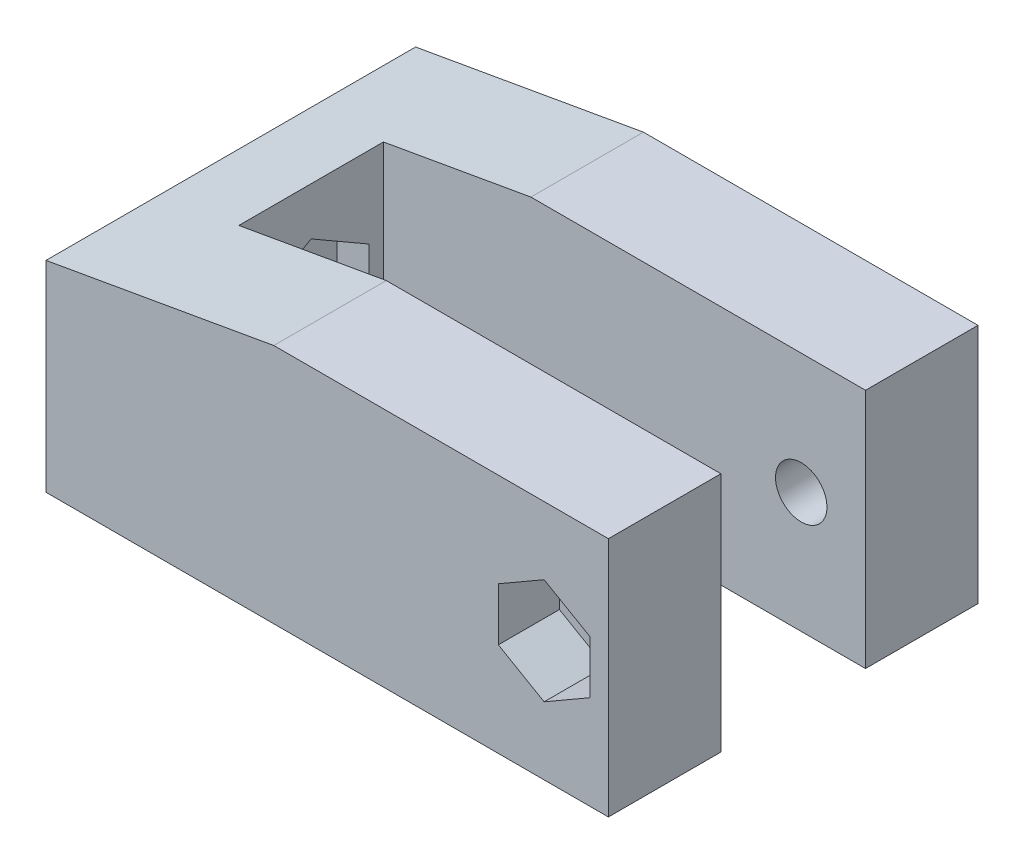
ISO-10303-21;
HEADER;
FILE_DESCRIPTION(('STEP AP214'),'2;1');
FILE_NAME('part.step','',(''),(''),'','','');
FILE_SCHEMA(('AUTOMOTIVE_DESIGN { 1 0 10303 214 1 1 1 1 }'));
ENDSEC;
DATA;
#1=APPLICATION_CONTEXT('core data for automotive mechanical design processes');
#2=APPLICATION_PROTOCOL_DEFINITION('international standard','automotive_design',2000,#1);
#3=PRODUCT_CONTEXT('',#1,'mechanical');
#4=PRODUCT('Part','Part','',(#3));
#5=PRODUCT_RELATED_PRODUCT_CATEGORY('part','',(#4));
#6=PRODUCT_DEFINITION_FORMATION('','',#4);
#7=PRODUCT_DEFINITION_CONTEXT('part definition',#1,'design');
#8=PRODUCT_DEFINITION('design','',#6,#7);
#9=PRODUCT_DEFINITION_SHAPE('','',#8);
#10=(LENGTH_UNIT() NAMED_UNIT(*) SI_UNIT(.MILLI.,.METRE.));
#11=(NAMED_UNIT(*) PLANE_ANGLE_UNIT() SI_UNIT($,.RADIAN.));
#12=(NAMED_UNIT(*) SI_UNIT($,.STERADIAN.) SOLID_ANGLE_UNIT());
#13=UNCERTAINTY_MEASURE_WITH_UNIT(LENGTH_MEASURE(1.E-05),#10,'distance_accuracy_value','');
#14=(GEOMETRIC_REPRESENTATION_CONTEXT(3) GLOBAL_UNCERTAINTY_ASSIGNED_CONTEXT((#13)) GLOBAL_UNIT_ASSIGNED_CONTEXT((#10,
#11,#12)) REPRESENTATION_CONTEXT('',''));
#15=CARTESIAN_POINT('',(0.,0.,0.));
#16=DIRECTION('',(0.,0.,1.));
#17=DIRECTION('',(1.,0.,0.));
#18=AXIS2_PLACEMENT_3D('',#15,#16,#17);
#19=CARTESIAN_POINT('',(31.,7.49999999999999,0.));
#20=DIRECTION('',(0.,0.,-1.));
#21=DIRECTION('',(0.,1.,0.));
#22=AXIS2_PLACEMENT_3D('',#19,#20,#21);
#23=CYLINDRICAL_SURFACE('',#22,1.6);
#24=CARTESIAN_POINT('',(31.,7.5,-7.));
#25=DIRECTION('',(0.,0.,1.));
#26=DIRECTION('',(0.,-1.,0.));
#27=AXIS2_PLACEMENT_3D('',#24,#25,#26);
#28=CIRCLE('',#27,1.6);
#29=CARTESIAN_POINT('',(31.,5.89999999999999,-7.));
#30=VERTEX_POINT('',#29);
#31=EDGE_CURVE('E343',#30,#30,#28,.T.);
#32=ORIENTED_EDGE('',*,*,#31,.F.);
#33=EDGE_LOOP('',(#32));
#34=FACE_BOUND('',#33,.T.);
#35=CARTESIAN_POINT('',(31.,7.49999999999999,-3.8));
#36=DIRECTION('',(0.,0.,1.));
#37=DIRECTION('',(1.,0.,0.));
#38=AXIS2_PLACEMENT_3D('',#35,#36,#37);
#39=CIRCLE('',#38,1.6);
#40=CARTESIAN_POINT('',(32.6,7.49999999999999,-3.8));
#41=VERTEX_POINT('',#40);
#42=EDGE_CURVE('E45',#41,#41,#39,.F.);
#43=ORIENTED_EDGE('',*,*,#42,.F.);
#44=EDGE_LOOP('',(#43));
#45=FACE_BOUND('',#44,.T.);
#46=ADVANCED_FACE('F41',(#34,#45),#23,.F.);
#47=CARTESIAN_POINT('',(31.,7.5,-16.));
#48=DIRECTION('',(0.,0.,-1.));
#49=DIRECTION('',(-1.,0.,0.));
#50=AXIS2_PLACEMENT_3D('',#47,#48,#49);
#51=CIRCLE('',#50,1.6);
#52=CARTESIAN_POINT('',(29.4,7.5,-16.));
#53=VERTEX_POINT('',#52);
#54=EDGE_CURVE('E344',#53,#53,#51,.T.);
#55=ORIENTED_EDGE('',*,*,#54,.F.);
#56=EDGE_LOOP('',(#55));
#57=FACE_BOUND('',#56,.T.);
#58=CARTESIAN_POINT('',(31.,7.5,-20.5));
#59=DIRECTION('',(0.,0.,-1.));
#60=DIRECTION('',(-1.,0.,0.));
#61=AXIS2_PLACEMENT_3D('',#58,#59,#60);
#62=CIRCLE('',#61,1.6);
#63=CARTESIAN_POINT('',(29.4,7.5,-20.5));
#64=VERTEX_POINT('',#63);
#65=EDGE_CURVE('E269',#64,#64,#62,.F.);
#66=ORIENTED_EDGE('',*,*,#65,.F.);
#67=EDGE_LOOP('',(#66));
#68=FACE_BOUND('',#67,.T.);
#69=ADVANCED_FACE('F454',(#57,#68),#23,.F.);
#70=CARTESIAN_POINT('',(10.,6.24999999999995,-11.5));
#71=DIRECTION('',(-1.,0.,0.));
#72=DIRECTION('',(0.,0.,1.));
#73=AXIS2_PLACEMENT_3D('',#70,#71,#72);
#74=CYLINDRICAL_SURFACE('',#73,2.2);
#75=CARTESIAN_POINT('',(0.,6.24999999999995,-11.5));
#76=DIRECTION('',(-1.,0.,0.));
#77=DIRECTION('',(0.,0.,1.));
#78=AXIS2_PLACEMENT_3D('',#75,#76,#77);
#79=CIRCLE('',#78,2.2);
#80=CARTESIAN_POINT('',(0.,6.24999999999995,-9.3));
#81=VERTEX_POINT('',#80);
#82=EDGE_CURVE('E339',#81,#81,#79,.T.);
#83=ORIENTED_EDGE('',*,*,#82,.T.);
#84=EDGE_LOOP('',(#83));
#85=FACE_BOUND('',#84,.T.);
#86=CARTESIAN_POINT('',(3.,6.24999999999995,-11.5));
#87=DIRECTION('',(1.,0.,0.));
#88=DIRECTION('',(0.,0.,-1.));
#89=AXIS2_PLACEMENT_3D('',#86,#87,#88);
#90=CIRCLE('',#89,2.2);
#91=CARTESIAN_POINT('',(3.,6.24999999999995,-13.7));
#92=VERTEX_POINT('',#91);
#93=EDGE_CURVE('E324',#92,#92,#90,.F.);
#94=ORIENTED_EDGE('',*,*,#93,.F.);
#95=EDGE_LOOP('',(#94));
#96=FACE_BOUND('',#95,.T.);
#97=ADVANCED_FACE('F456',(#85,#96),#74,.F.);
#98=CARTESIAN_POINT('',(35.,15.,0.));
#99=DIRECTION('',(0.,-1.,0.));
#100=DIRECTION('',(0.,0.,-1.));
#101=AXIS2_PLACEMENT_3D('',#98,#99,#100);
#102=PLANE('',#101);
#103=DIRECTION('',(-1.,0.,0.));
#104=VECTOR('',#103,1.);
#105=CARTESIAN_POINT('',(35.,15.,-23.));
#106=LINE('',#105,#104);
#107=CARTESIAN_POINT('',(35.,15.,-23.));
#108=VERTEX_POINT('',#107);
#109=CARTESIAN_POINT('',(14.1782045490451,15.,-23.));
#110=VERTEX_POINT('',#109);
#111=EDGE_CURVE('E410',#108,#110,#106,.T.);
#112=ORIENTED_EDGE('',*,*,#111,.T.);
#113=DIRECTION('',(0.,0.,1.));
#114=VECTOR('',#113,1.);
#115=CARTESIAN_POINT('',(14.1782045490451,15.,0.));
#116=LINE('',#115,#114);
#117=CARTESIAN_POINT('',(14.1782045490451,15.,-16.));
#118=VERTEX_POINT('',#117);
#119=EDGE_CURVE('E428',#110,#118,#116,.T.);
#120=ORIENTED_EDGE('',*,*,#119,.T.);
#121=DIRECTION('',(1.,0.,0.));
#122=VECTOR('',#121,1.);
#123=CARTESIAN_POINT('',(-17.4928556845359,15.,-16.));
#124=LINE('',#123,#122);
#125=CARTESIAN_POINT('',(35.,15.,-16.));
#126=VERTEX_POINT('',#125);
#127=EDGE_CURVE('E369',#118,#126,#124,.T.);
#128=ORIENTED_EDGE('',*,*,#127,.T.);
#129=DIRECTION('',(0.,0.,1.));
#130=VECTOR('',#129,1.);
#131=CARTESIAN_POINT('',(35.,15.,0.));
#132=LINE('',#131,#130);
#133=EDGE_CURVE('E394',#108,#126,#132,.T.);
#134=ORIENTED_EDGE('',*,*,#133,.F.);
#135=EDGE_LOOP('',(#112,#120,#128,#134));
#136=FACE_BOUND('',#135,.T.);
#137=ADVANCED_FACE('F463',(#136),#102,.F.);
#138=CARTESIAN_POINT('',(35.,0.,0.));
#139=DIRECTION('',(-1.,0.,0.));
#140=DIRECTION('',(0.,0.,1.));
#141=AXIS2_PLACEMENT_3D('',#138,#139,#140);
#142=PLANE('',#141);
#143=ORIENTED_EDGE('',*,*,#133,.T.);
#144=DIRECTION('',(0.,1.,0.));
#145=VECTOR('',#144,1.);
#146=CARTESIAN_POINT('',(35.,15.,-16.));
#147=LINE('',#146,#145);
#148=CARTESIAN_POINT('',(35.,0.,-16.));
#149=VERTEX_POINT('',#148);
#150=EDGE_CURVE('E349',#149,#126,#147,.T.);
#151=ORIENTED_EDGE('',*,*,#150,.F.);
#152=DIRECTION('',(0.,0.,-1.));
#153=VECTOR('',#152,1.);
#154=CARTESIAN_POINT('',(35.,0.,0.));
#155=LINE('',#154,#153);
#156=CARTESIAN_POINT('',(35.,0.,-23.));
#157=VERTEX_POINT('',#156);
#158=EDGE_CURVE('E384',#149,#157,#155,.T.);
#159=ORIENTED_EDGE('',*,*,#158,.T.);
#160=DIRECTION('',(0.,1.,0.));
#161=VECTOR('',#160,1.);
#162=CARTESIAN_POINT('',(35.,0.,-23.));
#163=LINE('',#162,#161);
#164=EDGE_CURVE('E390',#157,#108,#163,.T.);
#165=ORIENTED_EDGE('',*,*,#164,.T.);
#166=EDGE_LOOP('',(#143,#151,#159,#165));
#167=FACE_BOUND('',#166,.T.);
#168=ADVANCED_FACE('F488',(#167),#142,.F.);
#169=CARTESIAN_POINT('',(35.,0.,0.));
#170=DIRECTION('',(0.,0.,-1.));
#171=DIRECTION('',(0.,1.,0.));
#172=AXIS2_PLACEMENT_3D('',#169,#170,#171);
#173=PLANE('',#172);
#174=DIRECTION('',(0.,-1.,0.));
#175=VECTOR('',#174,1.);
#176=CARTESIAN_POINT('',(28.15,9.14544826719043,0.));
#177=LINE('',#176,#175);
#178=CARTESIAN_POINT('',(28.15,9.14544826719043,0.));
#179=VERTEX_POINT('',#178);
#180=CARTESIAN_POINT('',(28.15,5.85455173280956,0.));
#181=VERTEX_POINT('',#180);
#182=EDGE_CURVE('E237',#179,#181,#177,.T.);
#183=ORIENTED_EDGE('',*,*,#182,.F.);
#184=DIRECTION('',(-0.866025403784439,-0.5,0.));
#185=VECTOR('',#184,1.);
#186=CARTESIAN_POINT('',(31.,10.7908965343809,0.));
#187=LINE('',#186,#185);
#188=CARTESIAN_POINT('',(31.,10.7908965343809,0.));
#189=VERTEX_POINT('',#188);
#190=EDGE_CURVE('E59',#189,#179,#187,.T.);
#191=ORIENTED_EDGE('',*,*,#190,.F.);
#192=DIRECTION('',(-0.866025403784439,0.5,0.));
#193=VECTOR('',#192,1.);
#194=CARTESIAN_POINT('',(33.85,9.14544826719043,0.));
#195=LINE('',#194,#193);
#196=CARTESIAN_POINT('',(33.85,9.14544826719043,0.));
#197=VERTEX_POINT('',#196);
#198=EDGE_CURVE('E217',#197,#189,#195,.T.);
#199=ORIENTED_EDGE('',*,*,#198,.F.);
#200=DIRECTION('',(0.,1.,0.));
#201=VECTOR('',#200,1.);
#202=CARTESIAN_POINT('',(33.85,5.85455173280956,0.));
#203=LINE('',#202,#201);
#204=CARTESIAN_POINT('',(33.85,5.85455173280956,0.));
#205=VERTEX_POINT('',#204);
#206=EDGE_CURVE('E221',#205,#197,#203,.T.);
#207=ORIENTED_EDGE('',*,*,#206,.F.);
#208=DIRECTION('',(0.866025403784438,0.5,0.));
#209=VECTOR('',#208,1.);
#210=CARTESIAN_POINT('',(31.,4.20910346561912,0.));
#211=LINE('',#210,#209);
#212=CARTESIAN_POINT('',(31.,4.20910346561912,0.));
#213=VERTEX_POINT('',#212);
#214=EDGE_CURVE('E244',#213,#205,#211,.T.);
#215=ORIENTED_EDGE('',*,*,#214,.F.);
#216=DIRECTION('',(0.866025403784438,-0.5,0.));
#217=VECTOR('',#216,1.);
#218=CARTESIAN_POINT('',(28.15,5.85455173280956,0.));
#219=LINE('',#218,#217);
#220=EDGE_CURVE('E240',#181,#213,#219,.T.);
#221=ORIENTED_EDGE('',*,*,#220,.F.);
#222=EDGE_LOOP('',(#183,#191,#199,#207,#215,#221));
#223=FACE_BOUND('',#222,.T.);
#224=DIRECTION('',(-1.,0.,0.));
#225=VECTOR('',#224,1.);
#226=CARTESIAN_POINT('',(35.,15.,0.));
#227=LINE('',#226,#225);
#228=CARTESIAN_POINT('',(35.,15.,0.));
#229=VERTEX_POINT('',#228);
#230=CARTESIAN_POINT('',(14.1782045490451,15.,0.));
#231=VERTEX_POINT('',#230);
#232=EDGE_CURVE('E398',#229,#231,#227,.T.);
#233=ORIENTED_EDGE('',*,*,#232,.T.);
#234=DIRECTION('',(-0.984807753012209,-0.173648177666927,0.));
#235=VECTOR('',#234,1.);
#236=CARTESIAN_POINT('',(14.1782045490451,15.,0.));
#237=LINE('',#236,#235);
#238=CARTESIAN_POINT('',(0.,12.4999999999999,0.));
#239=VERTEX_POINT('',#238);
#240=EDGE_CURVE('E441',#231,#239,#237,.T.);
#241=ORIENTED_EDGE('',*,*,#240,.T.);
#242=DIRECTION('',(0.,-1.,0.));
#243=VECTOR('',#242,1.);
#244=CARTESIAN_POINT('',(0.,0.,0.));
#245=LINE('',#244,#243);
#246=CARTESIAN_POINT('',(0.,0.,0.));
#247=VERTEX_POINT('',#246);
#248=EDGE_CURVE('E379',#239,#247,#245,.T.);
#249=ORIENTED_EDGE('',*,*,#248,.T.);
#250=DIRECTION('',(-1.,0.,0.));
#251=VECTOR('',#250,1.);
#252=CARTESIAN_POINT('',(35.,0.,0.));
#253=LINE('',#252,#251);
#254=CARTESIAN_POINT('',(35.,0.,0.));
#255=VERTEX_POINT('',#254);
#256=EDGE_CURVE('E418',#255,#247,#253,.T.);
#257=ORIENTED_EDGE('',*,*,#256,.F.);
#258=DIRECTION('',(0.,-1.,0.));
#259=VECTOR('',#258,1.);
#260=CARTESIAN_POINT('',(35.,0.,0.));
#261=LINE('',#260,#259);
#262=EDGE_CURVE('E380',#229,#255,#261,.T.);
#263=ORIENTED_EDGE('',*,*,#262,.F.);
#264=EDGE_LOOP('',(#233,#241,#249,#257,#263));
#265=FACE_BOUND('',#264,.T.);
#266=ADVANCED_FACE('F501',(#223,#265),#173,.F.);
#267=CARTESIAN_POINT('',(35.,0.,0.));
#268=DIRECTION('',(0.,1.,0.));
#269=DIRECTION('',(0.,0.,1.));
#270=AXIS2_PLACEMENT_3D('',#267,#268,#269);
#271=PLANE('',#270);
#272=ORIENTED_EDGE('',*,*,#158,.F.);
#273=DIRECTION('',(1.,0.,0.));
#274=VECTOR('',#273,1.);
#275=CARTESIAN_POINT('',(-17.4928556845359,0.,-16.));
#276=LINE('',#275,#274);
#277=CARTESIAN_POINT('',(5.,0.,-16.));
#278=VERTEX_POINT('',#277);
#279=EDGE_CURVE('E359',#278,#149,#276,.T.);
#280=ORIENTED_EDGE('',*,*,#279,.F.);
#281=DIRECTION('',(0.,0.,-1.));
#282=VECTOR('',#281,1.);
#283=CARTESIAN_POINT('',(5.,0.,-7.));
#284=LINE('',#283,#282);
#285=CARTESIAN_POINT('',(5.,0.,-7.));
#286=VERTEX_POINT('',#285);
#287=EDGE_CURVE('E353',#286,#278,#284,.T.);
#288=ORIENTED_EDGE('',*,*,#287,.F.);
#289=DIRECTION('',(1.,0.,0.));
#290=VECTOR('',#289,1.);
#291=CARTESIAN_POINT('',(-17.4928556845359,0.,-7.));
#292=LINE('',#291,#290);
#293=CARTESIAN_POINT('',(35.,0.,-7.));
#294=VERTEX_POINT('',#293);
#295=EDGE_CURVE('E363',#286,#294,#292,.T.);
#296=ORIENTED_EDGE('',*,*,#295,.T.);
#297=EDGE_CURVE('E386',#255,#294,#155,.T.);
#298=ORIENTED_EDGE('',*,*,#297,.F.);
#299=ORIENTED_EDGE('',*,*,#256,.T.);
#300=DIRECTION('',(0.,0.,-1.));
#301=VECTOR('',#300,1.);
#302=CARTESIAN_POINT('',(0.,0.,0.));
#303=LINE('',#302,#301);
#304=CARTESIAN_POINT('',(0.,0.,-23.));
#305=VERTEX_POINT('',#304);
#306=EDGE_CURVE('E401',#247,#305,#303,.T.);
#307=ORIENTED_EDGE('',*,*,#306,.T.);
#308=DIRECTION('',(-1.,0.,0.));
#309=VECTOR('',#308,1.);
#310=CARTESIAN_POINT('',(35.,0.,-23.));
#311=LINE('',#310,#309);
#312=EDGE_CURVE('E414',#157,#305,#311,.T.);
#313=ORIENTED_EDGE('',*,*,#312,.F.);
#314=EDGE_LOOP('',(#272,#280,#288,#296,#298,#299,#307,#313));
#315=FACE_BOUND('',#314,.T.);
#316=ADVANCED_FACE('F498',(#315),#271,.F.);
#317=CARTESIAN_POINT('',(35.,0.,-23.));
#318=DIRECTION('',(0.,0.,1.));
#319=DIRECTION('',(0.,-1.,0.));
#320=AXIS2_PLACEMENT_3D('',#317,#318,#319);
#321=PLANE('',#320);
#322=CARTESIAN_POINT('',(31.,7.5,-23.));
#323=DIRECTION('',(0.,0.,-1.));
#324=DIRECTION('',(-1.,0.,0.));
#325=AXIS2_PLACEMENT_3D('',#322,#323,#324);
#326=CIRCLE('',#325,3.25);
#327=CARTESIAN_POINT('',(27.75,7.5,-23.));
#328=VERTEX_POINT('',#327);
#329=EDGE_CURVE('E270',#328,#328,#326,.T.);
#330=ORIENTED_EDGE('',*,*,#329,.F.);
#331=EDGE_LOOP('',(#330));
#332=FACE_BOUND('',#331,.T.);
#333=DIRECTION('',(0.,1.,0.));
#334=VECTOR('',#333,1.);
#335=CARTESIAN_POINT('',(0.,0.,-23.));
#336=LINE('',#335,#334);
#337=CARTESIAN_POINT('',(0.,12.4999999999999,-23.));
#338=VERTEX_POINT('',#337);
#339=EDGE_CURVE('E385',#305,#338,#336,.T.);
#340=ORIENTED_EDGE('',*,*,#339,.T.);
#341=DIRECTION('',(0.984807753012209,0.173648177666927,0.));
#342=VECTOR('',#341,1.);
#343=CARTESIAN_POINT('',(14.1782045490451,15.,-23.));
#344=LINE('',#343,#342);
#345=EDGE_CURVE('E12',#338,#110,#344,.T.);
#346=ORIENTED_EDGE('',*,*,#345,.T.);
#347=ORIENTED_EDGE('',*,*,#111,.F.);
#348=ORIENTED_EDGE('',*,*,#164,.F.);
#349=ORIENTED_EDGE('',*,*,#312,.T.);
#350=EDGE_LOOP('',(#340,#346,#347,#348,#349));
#351=FACE_BOUND('',#350,.T.);
#352=ADVANCED_FACE('F494',(#332,#351),#321,.F.);
#353=DIRECTION('',(1.,0.,0.));
#354=VECTOR('',#353,1.);
#355=CARTESIAN_POINT('',(-17.4928556845359,15.,-7.));
#356=LINE('',#355,#354);
#357=CARTESIAN_POINT('',(14.1782045490451,15.,-7.));
#358=VERTEX_POINT('',#357);
#359=CARTESIAN_POINT('',(35.,15.,-7.));
#360=VERTEX_POINT('',#359);
#361=EDGE_CURVE('E364',#358,#360,#356,.T.);
#362=ORIENTED_EDGE('',*,*,#361,.F.);
#363=DIRECTION('',(0.,0.,1.));
#364=VECTOR('',#363,1.);
#365=CARTESIAN_POINT('',(14.1782045490451,15.,0.));
#366=LINE('',#365,#364);
#367=EDGE_CURVE('E422',#358,#231,#366,.T.);
#368=ORIENTED_EDGE('',*,*,#367,.T.);
#369=ORIENTED_EDGE('',*,*,#232,.F.);
#370=EDGE_CURVE('E393',#360,#229,#132,.T.);
#371=ORIENTED_EDGE('',*,*,#370,.F.);
#372=EDGE_LOOP('',(#362,#368,#369,#371));
#373=FACE_BOUND('',#372,.T.);
#374=ADVANCED_FACE('F486',(#373),#102,.F.);
#375=ORIENTED_EDGE('',*,*,#297,.T.);
#376=DIRECTION('',(0.,-1.,0.));
#377=VECTOR('',#376,1.);
#378=CARTESIAN_POINT('',(35.,15.,-7.));
#379=LINE('',#378,#377);
#380=EDGE_CURVE('E348',#360,#294,#379,.T.);
#381=ORIENTED_EDGE('',*,*,#380,.F.);
#382=ORIENTED_EDGE('',*,*,#370,.T.);
#383=ORIENTED_EDGE('',*,*,#262,.T.);
#384=EDGE_LOOP('',(#375,#381,#382,#383));
#385=FACE_BOUND('',#384,.T.);
#386=ADVANCED_FACE('F483',(#385),#142,.F.);
#387=CARTESIAN_POINT('',(0.,0.,0.));
#388=DIRECTION('',(-1.,0.,0.));
#389=DIRECTION('',(0.,0.,1.));
#390=AXIS2_PLACEMENT_3D('',#387,#388,#389);
#391=PLANE('',#390);
#392=ORIENTED_EDGE('',*,*,#82,.F.);
#393=EDGE_LOOP('',(#392));
#394=FACE_BOUND('',#393,.T.);
#395=ORIENTED_EDGE('',*,*,#248,.F.);
#396=DIRECTION('',(0.,0.,-1.));
#397=VECTOR('',#396,1.);
#398=CARTESIAN_POINT('',(0.,12.4999999999999,-23.));
#399=LINE('',#398,#397);
#400=EDGE_CURVE('E51',#239,#338,#399,.T.);
#401=ORIENTED_EDGE('',*,*,#400,.T.);
#402=ORIENTED_EDGE('',*,*,#339,.F.);
#403=ORIENTED_EDGE('',*,*,#306,.F.);
#404=EDGE_LOOP('',(#395,#401,#402,#403));
#405=FACE_BOUND('',#404,.T.);
#406=ADVANCED_FACE('F481',(#394,#405),#391,.T.);
#407=CARTESIAN_POINT('',(5.,0.,0.));
#408=DIRECTION('',(-1.,0.,0.));
#409=DIRECTION('',(0.,0.,1.));
#410=AXIS2_PLACEMENT_3D('',#407,#408,#409);
#411=PLANE('',#410);
#412=DIRECTION('',(0.,-1.,0.));
#413=VECTOR('',#412,1.);
#414=CARTESIAN_POINT('',(5.,8.3284609690826,-7.9));
#415=LINE('',#414,#413);
#416=CARTESIAN_POINT('',(5.,8.3284609690826,-7.9));
#417=VERTEX_POINT('',#416);
#418=CARTESIAN_POINT('',(5.,4.1715390309173,-7.9));
#419=VERTEX_POINT('',#418);
#420=EDGE_CURVE('E302',#417,#419,#415,.T.);
#421=ORIENTED_EDGE('',*,*,#420,.F.);
#422=DIRECTION('',(0.,-0.5,0.866025403784439));
#423=VECTOR('',#422,1.);
#424=CARTESIAN_POINT('',(5.,10.4069219381653,-11.5));
#425=LINE('',#424,#423);
#426=CARTESIAN_POINT('',(5.,10.4069219381653,-11.5));
#427=VERTEX_POINT('',#426);
#428=EDGE_CURVE('E67',#427,#417,#425,.T.);
#429=ORIENTED_EDGE('',*,*,#428,.F.);
#430=DIRECTION('',(0.,0.5,0.866025403784438));
#431=VECTOR('',#430,1.);
#432=CARTESIAN_POINT('',(5.,8.32846096908261,-15.1));
#433=LINE('',#432,#431);
#434=CARTESIAN_POINT('',(5.,8.32846096908261,-15.1));
#435=VERTEX_POINT('',#434);
#436=EDGE_CURVE('E279',#435,#427,#433,.T.);
#437=ORIENTED_EDGE('',*,*,#436,.F.);
#438=DIRECTION('',(0.,1.,0.));
#439=VECTOR('',#438,1.);
#440=CARTESIAN_POINT('',(5.,4.1715390309173,-15.1));
#441=LINE('',#440,#439);
#442=CARTESIAN_POINT('',(5.,4.1715390309173,-15.1));
#443=VERTEX_POINT('',#442);
#444=EDGE_CURVE('E314',#443,#435,#441,.T.);
#445=ORIENTED_EDGE('',*,*,#444,.F.);
#446=DIRECTION('',(0.,0.5,-0.866025403784438));
#447=VECTOR('',#446,1.);
#448=CARTESIAN_POINT('',(5.,2.09307806183464,-11.5));
#449=LINE('',#448,#447);
#450=CARTESIAN_POINT('',(5.,2.09307806183464,-11.5));
#451=VERTEX_POINT('',#450);
#452=EDGE_CURVE('E310',#451,#443,#449,.T.);
#453=ORIENTED_EDGE('',*,*,#452,.F.);
#454=DIRECTION('',(0.,-0.5,-0.866025403784438));
#455=VECTOR('',#454,1.);
#456=CARTESIAN_POINT('',(5.,4.1715390309173,-7.9));
#457=LINE('',#456,#455);
#458=EDGE_CURVE('E306',#419,#451,#457,.T.);
#459=ORIENTED_EDGE('',*,*,#458,.F.);
#460=EDGE_LOOP('',(#421,#429,#437,#445,#453,#459));
#461=FACE_BOUND('',#460,.T.);
#462=DIRECTION('',(0.,1.,0.));
#463=VECTOR('',#462,1.);
#464=CARTESIAN_POINT('',(5.,15.,-16.));
#465=LINE('',#464,#463);
#466=CARTESIAN_POINT('',(5.,13.3816349035422,-16.));
#467=VERTEX_POINT('',#466);
#468=EDGE_CURVE('E365',#278,#467,#465,.T.);
#469=ORIENTED_EDGE('',*,*,#468,.T.);
#470=DIRECTION('',(0.,0.,1.));
#471=VECTOR('',#470,1.);
#472=CARTESIAN_POINT('',(5.,13.3816349035422,0.));
#473=LINE('',#472,#471);
#474=CARTESIAN_POINT('',(5.,13.3816349035422,-7.));
#475=VERTEX_POINT('',#474);
#476=EDGE_CURVE('E435',#467,#475,#473,.T.);
#477=ORIENTED_EDGE('',*,*,#476,.T.);
#478=DIRECTION('',(0.,-1.,0.));
#479=VECTOR('',#478,1.);
#480=CARTESIAN_POINT('',(5.,15.,-7.));
#481=LINE('',#480,#479);
#482=EDGE_CURVE('E360',#475,#286,#481,.T.);
#483=ORIENTED_EDGE('',*,*,#482,.T.);
#484=ORIENTED_EDGE('',*,*,#287,.T.);
#485=EDGE_LOOP('',(#469,#477,#483,#484));
#486=FACE_BOUND('',#485,.T.);
#487=ADVANCED_FACE('F477',(#461,#486),#411,.F.);
#488=CARTESIAN_POINT('',(-17.4928556845359,15.,-16.));
#489=DIRECTION('',(0.,0.,-1.));
#490=DIRECTION('',(-1.,0.,0.));
#491=AXIS2_PLACEMENT_3D('',#488,#489,#490);
#492=PLANE('',#491);
#493=ORIENTED_EDGE('',*,*,#54,.T.);
#494=EDGE_LOOP('',(#493));
#495=FACE_BOUND('',#494,.T.);
#496=ORIENTED_EDGE('',*,*,#127,.F.);
#497=DIRECTION('',(-0.984807753012209,-0.173648177666927,0.));
#498=VECTOR('',#497,1.);
#499=CARTESIAN_POINT('',(14.1782045490451,15.,-16.));
#500=LINE('',#499,#498);
#501=EDGE_CURVE('E432',#118,#467,#500,.T.);
#502=ORIENTED_EDGE('',*,*,#501,.T.);
#503=ORIENTED_EDGE('',*,*,#468,.F.);
#504=ORIENTED_EDGE('',*,*,#279,.T.);
#505=ORIENTED_EDGE('',*,*,#150,.T.);
#506=EDGE_LOOP('',(#496,#502,#503,#504,#505));
#507=FACE_BOUND('',#506,.T.);
#508=ADVANCED_FACE('F473',(#495,#507),#492,.F.);
#509=CARTESIAN_POINT('',(-17.4928556845359,15.,-7.));
#510=DIRECTION('',(0.,0.,1.));
#511=DIRECTION('',(0.,-1.,0.));
#512=AXIS2_PLACEMENT_3D('',#509,#510,#511);
#513=PLANE('',#512);
#514=ORIENTED_EDGE('',*,*,#31,.T.);
#515=EDGE_LOOP('',(#514));
#516=FACE_BOUND('',#515,.T.);
#517=ORIENTED_EDGE('',*,*,#482,.F.);
#518=DIRECTION('',(0.984807753012209,0.173648177666927,0.));
#519=VECTOR('',#518,1.);
#520=CARTESIAN_POINT('',(14.1782045490451,15.,-7.));
#521=LINE('',#520,#519);
#522=EDGE_CURVE('E438',#475,#358,#521,.T.);
#523=ORIENTED_EDGE('',*,*,#522,.T.);
#524=ORIENTED_EDGE('',*,*,#361,.T.);
#525=ORIENTED_EDGE('',*,*,#380,.T.);
#526=ORIENTED_EDGE('',*,*,#295,.F.);
#527=EDGE_LOOP('',(#517,#523,#524,#525,#526));
#528=FACE_BOUND('',#527,.T.);
#529=ADVANCED_FACE('F470',(#516,#528),#513,.F.);
#530=CARTESIAN_POINT('',(14.1782045490451,15.,0.));
#531=DIRECTION('',(-0.173648177666927,0.984807753012209,0.));
#532=DIRECTION('',(0.,0.,-1.));
#533=AXIS2_PLACEMENT_3D('',#530,#531,#532);
#534=PLANE('',#533);
#535=ORIENTED_EDGE('',*,*,#345,.F.);
#536=ORIENTED_EDGE('',*,*,#400,.F.);
#537=ORIENTED_EDGE('',*,*,#240,.F.);
#538=ORIENTED_EDGE('',*,*,#367,.F.);
#539=ORIENTED_EDGE('',*,*,#522,.F.);
#540=ORIENTED_EDGE('',*,*,#476,.F.);
#541=ORIENTED_EDGE('',*,*,#501,.F.);
#542=ORIENTED_EDGE('',*,*,#119,.F.);
#543=EDGE_LOOP('',(#535,#536,#537,#538,#539,#540,#541,#542));
#544=FACE_BOUND('',#543,.T.);
#545=ADVANCED_FACE('F43',(#544),#534,.T.);
#546=CARTESIAN_POINT('',(3.,0.,0.));
#547=DIRECTION('',(1.,0.,0.));
#548=DIRECTION('',(0.,0.,-1.));
#549=AXIS2_PLACEMENT_3D('',#546,#547,#548);
#550=PLANE('',#549);
#551=DIRECTION('',(0.,-0.5,0.866025403784439));
#552=VECTOR('',#551,1.);
#553=CARTESIAN_POINT('',(3.,10.4069219381653,-11.5));
#554=LINE('',#553,#552);
#555=CARTESIAN_POINT('',(3.,10.4069219381653,-11.5));
#556=VERTEX_POINT('',#555);
#557=CARTESIAN_POINT('',(3.,8.3284609690826,-7.9));
#558=VERTEX_POINT('',#557);
#559=EDGE_CURVE('E274',#556,#558,#554,.T.);
#560=ORIENTED_EDGE('',*,*,#559,.T.);
#561=DIRECTION('',(0.,-1.,0.));
#562=VECTOR('',#561,1.);
#563=CARTESIAN_POINT('',(3.,8.3284609690826,-7.9));
#564=LINE('',#563,#562);
#565=CARTESIAN_POINT('',(3.,4.1715390309173,-7.9));
#566=VERTEX_POINT('',#565);
#567=EDGE_CURVE('E278',#558,#566,#564,.T.);
#568=ORIENTED_EDGE('',*,*,#567,.T.);
#569=DIRECTION('',(0.,-0.5,-0.866025403784438));
#570=VECTOR('',#569,1.);
#571=CARTESIAN_POINT('',(3.,4.1715390309173,-7.9));
#572=LINE('',#571,#570);
#573=CARTESIAN_POINT('',(3.,2.09307806183464,-11.5));
#574=VERTEX_POINT('',#573);
#575=EDGE_CURVE('E283',#566,#574,#572,.T.);
#576=ORIENTED_EDGE('',*,*,#575,.T.);
#577=DIRECTION('',(0.,0.5,-0.866025403784438));
#578=VECTOR('',#577,1.);
#579=CARTESIAN_POINT('',(3.,2.09307806183464,-11.5));
#580=LINE('',#579,#578);
#581=CARTESIAN_POINT('',(3.,4.1715390309173,-15.1));
#582=VERTEX_POINT('',#581);
#583=EDGE_CURVE('E287',#574,#582,#580,.T.);
#584=ORIENTED_EDGE('',*,*,#583,.T.);
#585=DIRECTION('',(0.,1.,0.));
#586=VECTOR('',#585,1.);
#587=CARTESIAN_POINT('',(3.,4.1715390309173,-15.1));
#588=LINE('',#587,#586);
#589=CARTESIAN_POINT('',(3.,8.32846096908261,-15.1));
#590=VERTEX_POINT('',#589);
#591=EDGE_CURVE('E291',#582,#590,#588,.T.);
#592=ORIENTED_EDGE('',*,*,#591,.T.);
#593=DIRECTION('',(0.,0.5,0.866025403784438));
#594=VECTOR('',#593,1.);
#595=CARTESIAN_POINT('',(3.,8.32846096908261,-15.1));
#596=LINE('',#595,#594);
#597=EDGE_CURVE('E295',#590,#556,#596,.T.);
#598=ORIENTED_EDGE('',*,*,#597,.T.);
#599=EDGE_LOOP('',(#560,#568,#576,#584,#592,#598));
#600=FACE_BOUND('',#599,.T.);
#601=ORIENTED_EDGE('',*,*,#93,.T.);
#602=EDGE_LOOP('',(#601));
#603=FACE_BOUND('',#602,.T.);
#604=ADVANCED_FACE('F598',(#600,#603),#550,.T.);
#605=CARTESIAN_POINT('',(3.,10.4069219381653,-11.5));
#606=DIRECTION('',(0.,0.866025403784439,0.5));
#607=DIRECTION('',(0.,-0.5,0.866025403784439));
#608=AXIS2_PLACEMENT_3D('',#605,#606,#607);
#609=PLANE('',#608);
#610=ORIENTED_EDGE('',*,*,#428,.T.);
#611=DIRECTION('',(1.,0.,0.));
#612=VECTOR('',#611,1.);
#613=CARTESIAN_POINT('',(3.,8.3284609690826,-7.9));
#614=LINE('',#613,#612);
#615=EDGE_CURVE('E299',#558,#417,#614,.T.);
#616=ORIENTED_EDGE('',*,*,#615,.F.);
#617=ORIENTED_EDGE('',*,*,#559,.F.);
#618=DIRECTION('',(1.,0.,0.));
#619=VECTOR('',#618,1.);
#620=CARTESIAN_POINT('',(3.,10.4069219381653,-11.5));
#621=LINE('',#620,#619);
#622=EDGE_CURVE('E321',#556,#427,#621,.T.);
#623=ORIENTED_EDGE('',*,*,#622,.T.);
#624=EDGE_LOOP('',(#610,#616,#617,#623));
#625=FACE_BOUND('',#624,.T.);
#626=ADVANCED_FACE('F603',(#625),#609,.F.);
#627=CARTESIAN_POINT('',(3.,8.32846096908261,-15.1));
#628=DIRECTION('',(0.,0.866025403784439,-0.5));
#629=DIRECTION('',(0.,0.5,0.866025403784439));
#630=AXIS2_PLACEMENT_3D('',#627,#628,#629);
#631=PLANE('',#630);
#632=ORIENTED_EDGE('',*,*,#436,.T.);
#633=ORIENTED_EDGE('',*,*,#622,.F.);
#634=ORIENTED_EDGE('',*,*,#597,.F.);
#635=DIRECTION('',(1.,0.,0.));
#636=VECTOR('',#635,1.);
#637=CARTESIAN_POINT('',(3.,8.32846096908261,-15.1));
#638=LINE('',#637,#636);
#639=EDGE_CURVE('E325',#590,#435,#638,.T.);
#640=ORIENTED_EDGE('',*,*,#639,.T.);
#641=EDGE_LOOP('',(#632,#633,#634,#640));
#642=FACE_BOUND('',#641,.T.);
#643=ADVANCED_FACE('F611',(#642),#631,.F.);
#644=CARTESIAN_POINT('',(3.,4.1715390309173,-15.1));
#645=DIRECTION('',(0.,0.,-1.));
#646=DIRECTION('',(-1.,0.,0.));
#647=AXIS2_PLACEMENT_3D('',#644,#645,#646);
#648=PLANE('',#647);
#649=ORIENTED_EDGE('',*,*,#444,.T.);
#650=ORIENTED_EDGE('',*,*,#639,.F.);
#651=ORIENTED_EDGE('',*,*,#591,.F.);
#652=DIRECTION('',(1.,0.,0.));
#653=VECTOR('',#652,1.);
#654=CARTESIAN_POINT('',(3.,4.1715390309173,-15.1));
#655=LINE('',#654,#653);
#656=EDGE_CURVE('E328',#582,#443,#655,.T.);
#657=ORIENTED_EDGE('',*,*,#656,.T.);
#658=EDGE_LOOP('',(#649,#650,#651,#657));
#659=FACE_BOUND('',#658,.T.);
#660=ADVANCED_FACE('F617',(#659),#648,.F.);
#661=CARTESIAN_POINT('',(3.,2.09307806183464,-11.5));
#662=DIRECTION('',(0.,-0.866025403784439,-0.5));
#663=DIRECTION('',(0.,0.5,-0.866025403784439));
#664=AXIS2_PLACEMENT_3D('',#661,#662,#663);
#665=PLANE('',#664);
#666=ORIENTED_EDGE('',*,*,#452,.T.);
#667=ORIENTED_EDGE('',*,*,#656,.F.);
#668=ORIENTED_EDGE('',*,*,#583,.F.);
#669=DIRECTION('',(1.,0.,0.));
#670=VECTOR('',#669,1.);
#671=CARTESIAN_POINT('',(3.,2.09307806183464,-11.5));
#672=LINE('',#671,#670);
#673=EDGE_CURVE('E331',#574,#451,#672,.T.);
#674=ORIENTED_EDGE('',*,*,#673,.T.);
#675=EDGE_LOOP('',(#666,#667,#668,#674));
#676=FACE_BOUND('',#675,.T.);
#677=ADVANCED_FACE('F625',(#676),#665,.F.);
#678=CARTESIAN_POINT('',(3.,4.1715390309173,-7.9));
#679=DIRECTION('',(0.,-0.866025403784439,0.5));
#680=DIRECTION('',(0.,-0.5,-0.866025403784439));
#681=AXIS2_PLACEMENT_3D('',#678,#679,#680);
#682=PLANE('',#681);
#683=ORIENTED_EDGE('',*,*,#458,.T.);
#684=ORIENTED_EDGE('',*,*,#673,.F.);
#685=ORIENTED_EDGE('',*,*,#575,.F.);
#686=DIRECTION('',(1.,0.,0.));
#687=VECTOR('',#686,1.);
#688=CARTESIAN_POINT('',(3.,4.1715390309173,-7.9));
#689=LINE('',#688,#687);
#690=EDGE_CURVE('E334',#566,#419,#689,.T.);
#691=ORIENTED_EDGE('',*,*,#690,.T.);
#692=EDGE_LOOP('',(#683,#684,#685,#691));
#693=FACE_BOUND('',#692,.T.);
#694=ADVANCED_FACE('F633',(#693),#682,.F.);
#695=CARTESIAN_POINT('',(3.,8.3284609690826,-7.9));
#696=DIRECTION('',(0.,0.,1.));
#697=DIRECTION('',(0.,-1.,0.));
#698=AXIS2_PLACEMENT_3D('',#695,#696,#697);
#699=PLANE('',#698);
#700=ORIENTED_EDGE('',*,*,#420,.T.);
#701=ORIENTED_EDGE('',*,*,#690,.F.);
#702=ORIENTED_EDGE('',*,*,#567,.F.);
#703=ORIENTED_EDGE('',*,*,#615,.T.);
#704=EDGE_LOOP('',(#700,#701,#702,#703));
#705=FACE_BOUND('',#704,.T.);
#706=ADVANCED_FACE('F641',(#705),#699,.F.);
#707=CARTESIAN_POINT('',(31.,7.5,-20.5));
#708=DIRECTION('',(0.,0.,-1.));
#709=DIRECTION('',(-1.,0.,0.));
#710=AXIS2_PLACEMENT_3D('',#707,#708,#709);
#711=PLANE('',#710);
#712=CARTESIAN_POINT('',(31.,7.5,-20.5));
#713=DIRECTION('',(0.,0.,-1.));
#714=DIRECTION('',(-1.,0.,0.));
#715=AXIS2_PLACEMENT_3D('',#712,#713,#714);
#716=CIRCLE('',#715,3.25);
#717=CARTESIAN_POINT('',(27.75,7.5,-20.5));
#718=VERTEX_POINT('',#717);
#719=EDGE_CURVE('E265',#718,#718,#716,.T.);
#720=ORIENTED_EDGE('',*,*,#719,.T.);
#721=EDGE_LOOP('',(#720));
#722=FACE_BOUND('',#721,.T.);
#723=ORIENTED_EDGE('',*,*,#65,.T.);
#724=EDGE_LOOP('',(#723));
#725=FACE_BOUND('',#724,.T.);
#726=ADVANCED_FACE('F452',(#722,#725),#711,.T.);
#727=CARTESIAN_POINT('',(31.,7.5,-20.5));
#728=DIRECTION('',(0.,0.,-1.));
#729=DIRECTION('',(-1.,0.,0.));
#730=AXIS2_PLACEMENT_3D('',#727,#728,#729);
#731=CYLINDRICAL_SURFACE('',#730,3.25);
#732=ORIENTED_EDGE('',*,*,#719,.F.);
#733=EDGE_LOOP('',(#732));
#734=FACE_BOUND('',#733,.T.);
#735=ORIENTED_EDGE('',*,*,#329,.T.);
#736=EDGE_LOOP('',(#735));
#737=FACE_BOUND('',#736,.T.);
#738=ADVANCED_FACE('F656',(#734,#737),#731,.F.);
#739=CARTESIAN_POINT('',(0.,0.,-3.8));
#740=DIRECTION('',(0.,0.,1.));
#741=DIRECTION('',(1.,0.,0.));
#742=AXIS2_PLACEMENT_3D('',#739,#740,#741);
#743=PLANE('',#742);
#744=DIRECTION('',(-0.866025403784439,-0.5,0.));
#745=VECTOR('',#744,1.);
#746=CARTESIAN_POINT('',(31.,10.7908965343809,-3.8));
#747=LINE('',#746,#745);
#748=CARTESIAN_POINT('',(31.,10.7908965343809,-3.8));
#749=VERTEX_POINT('',#748);
#750=CARTESIAN_POINT('',(28.15,9.14544826719043,-3.8));
#751=VERTEX_POINT('',#750);
#752=EDGE_CURVE('E194',#749,#751,#747,.T.);
#753=ORIENTED_EDGE('',*,*,#752,.T.);
#754=DIRECTION('',(0.,-1.,0.));
#755=VECTOR('',#754,1.);
#756=CARTESIAN_POINT('',(28.15,9.14544826719043,-3.8));
#757=LINE('',#756,#755);
#758=CARTESIAN_POINT('',(28.15,5.85455173280956,-3.8));
#759=VERTEX_POINT('',#758);
#760=EDGE_CURVE('E204',#751,#759,#757,.T.);
#761=ORIENTED_EDGE('',*,*,#760,.T.);
#762=DIRECTION('',(0.866025403784438,-0.5,0.));
#763=VECTOR('',#762,1.);
#764=CARTESIAN_POINT('',(28.15,5.85455173280956,-3.8));
#765=LINE('',#764,#763);
#766=CARTESIAN_POINT('',(31.,4.20910346561912,-3.8));
#767=VERTEX_POINT('',#766);
#768=EDGE_CURVE('E210',#759,#767,#765,.T.);
#769=ORIENTED_EDGE('',*,*,#768,.T.);
#770=DIRECTION('',(0.866025403784438,0.5,0.));
#771=VECTOR('',#770,1.);
#772=CARTESIAN_POINT('',(31.,4.20910346561912,-3.8));
#773=LINE('',#772,#771);
#774=CARTESIAN_POINT('',(33.85,5.85455173280956,-3.8));
#775=VERTEX_POINT('',#774);
#776=EDGE_CURVE('E226',#767,#775,#773,.T.);
#777=ORIENTED_EDGE('',*,*,#776,.T.);
#778=DIRECTION('',(0.,1.,0.));
#779=VECTOR('',#778,1.);
#780=CARTESIAN_POINT('',(33.85,5.85455173280956,-3.8));
#781=LINE('',#780,#779);
#782=CARTESIAN_POINT('',(33.85,9.14544826719043,-3.8));
#783=VERTEX_POINT('',#782);
#784=EDGE_CURVE('E230',#775,#783,#781,.T.);
#785=ORIENTED_EDGE('',*,*,#784,.T.);
#786=DIRECTION('',(-0.866025403784439,0.5,0.));
#787=VECTOR('',#786,1.);
#788=CARTESIAN_POINT('',(33.85,9.14544826719043,-3.8));
#789=LINE('',#788,#787);
#790=EDGE_CURVE('E201',#783,#749,#789,.T.);
#791=ORIENTED_EDGE('',*,*,#790,.T.);
#792=EDGE_LOOP('',(#753,#761,#769,#777,#785,#791));
#793=FACE_BOUND('',#792,.T.);
#794=ORIENTED_EDGE('',*,*,#42,.T.);
#795=EDGE_LOOP('',(#794));
#796=FACE_BOUND('',#795,.T.);
#797=ADVANCED_FACE('F212',(#793,#796),#743,.T.);
#798=CARTESIAN_POINT('',(31.,10.7908965343809,-3.8));
#799=DIRECTION('',(-0.5,0.866025403784438,0.));
#800=DIRECTION('',(-0.866025403784439,-0.5,0.));
#801=AXIS2_PLACEMENT_3D('',#798,#799,#800);
#802=PLANE('',#801);
#803=ORIENTED_EDGE('',*,*,#190,.T.);
#804=DIRECTION('',(0.,0.,1.));
#805=VECTOR('',#804,1.);
#806=CARTESIAN_POINT('',(28.15,9.14544826719043,-3.8));
#807=LINE('',#806,#805);
#808=EDGE_CURVE('E190',#751,#179,#807,.T.);
#809=ORIENTED_EDGE('',*,*,#808,.F.);
#810=ORIENTED_EDGE('',*,*,#752,.F.);
#811=DIRECTION('',(0.,0.,1.));
#812=VECTOR('',#811,1.);
#813=CARTESIAN_POINT('',(31.,10.7908965343809,-3.8));
#814=LINE('',#813,#812);
#815=EDGE_CURVE('E251',#749,#189,#814,.T.);
#816=ORIENTED_EDGE('',*,*,#815,.T.);
#817=EDGE_LOOP('',(#803,#809,#810,#816));
#818=FACE_BOUND('',#817,.T.);
#819=ADVANCED_FACE('F192',(#818),#802,.F.);
#820=CARTESIAN_POINT('',(33.85,9.14544826719043,-3.8));
#821=DIRECTION('',(0.5,0.866025403784439,0.));
#822=DIRECTION('',(-0.866025403784439,0.5,0.));
#823=AXIS2_PLACEMENT_3D('',#820,#821,#822);
#824=PLANE('',#823);
#825=ORIENTED_EDGE('',*,*,#198,.T.);
#826=ORIENTED_EDGE('',*,*,#815,.F.);
#827=ORIENTED_EDGE('',*,*,#790,.F.);
#828=DIRECTION('',(0.,0.,1.));
#829=VECTOR('',#828,1.);
#830=CARTESIAN_POINT('',(33.85,9.14544826719043,-3.8));
#831=LINE('',#830,#829);
#832=EDGE_CURVE('E254',#783,#197,#831,.T.);
#833=ORIENTED_EDGE('',*,*,#832,.T.);
#834=EDGE_LOOP('',(#825,#826,#827,#833));
#835=FACE_BOUND('',#834,.T.);
#836=ADVANCED_FACE('F679',(#835),#824,.F.);
#837=CARTESIAN_POINT('',(33.85,5.85455173280956,-3.8));
#838=DIRECTION('',(1.,0.,0.));
#839=DIRECTION('',(0.,0.,-1.));
#840=AXIS2_PLACEMENT_3D('',#837,#838,#839);
#841=PLANE('',#840);
#842=ORIENTED_EDGE('',*,*,#206,.T.);
#843=ORIENTED_EDGE('',*,*,#832,.F.);
#844=ORIENTED_EDGE('',*,*,#784,.F.);
#845=DIRECTION('',(0.,0.,1.));
#846=VECTOR('',#845,1.);
#847=CARTESIAN_POINT('',(33.85,5.85455173280956,-3.8));
#848=LINE('',#847,#846);
#849=EDGE_CURVE('E257',#775,#205,#848,.T.);
#850=ORIENTED_EDGE('',*,*,#849,.T.);
#851=EDGE_LOOP('',(#842,#843,#844,#850));
#852=FACE_BOUND('',#851,.T.);
#853=ADVANCED_FACE('F686',(#852),#841,.F.);
#854=CARTESIAN_POINT('',(31.,4.20910346561912,-3.8));
#855=DIRECTION('',(0.5,-0.866025403784438,0.));
#856=DIRECTION('',(0.866025403784438,0.5,0.));
#857=AXIS2_PLACEMENT_3D('',#854,#855,#856);
#858=PLANE('',#857);
#859=ORIENTED_EDGE('',*,*,#214,.T.);
#860=ORIENTED_EDGE('',*,*,#849,.F.);
#861=ORIENTED_EDGE('',*,*,#776,.F.);
#862=DIRECTION('',(0.,0.,1.));
#863=VECTOR('',#862,1.);
#864=CARTESIAN_POINT('',(31.,4.20910346561912,-3.8));
#865=LINE('',#864,#863);
#866=EDGE_CURVE('E260',#767,#213,#865,.T.);
#867=ORIENTED_EDGE('',*,*,#866,.T.);
#868=EDGE_LOOP('',(#859,#860,#861,#867));
#869=FACE_BOUND('',#868,.T.);
#870=ADVANCED_FACE('F694',(#869),#858,.F.);
#871=CARTESIAN_POINT('',(28.15,5.85455173280956,-3.8));
#872=DIRECTION('',(-0.5,-0.866025403784438,0.));
#873=DIRECTION('',(0.866025403784439,-0.5,0.));
#874=AXIS2_PLACEMENT_3D('',#871,#872,#873);
#875=PLANE('',#874);
#876=ORIENTED_EDGE('',*,*,#220,.T.);
#877=ORIENTED_EDGE('',*,*,#866,.F.);
#878=ORIENTED_EDGE('',*,*,#768,.F.);
#879=DIRECTION('',(0.,0.,1.));
#880=VECTOR('',#879,1.);
#881=CARTESIAN_POINT('',(28.15,5.85455173280956,-3.8));
#882=LINE('',#881,#880);
#883=EDGE_CURVE('E200',#759,#181,#882,.T.);
#884=ORIENTED_EDGE('',*,*,#883,.T.);
#885=EDGE_LOOP('',(#876,#877,#878,#884));
#886=FACE_BOUND('',#885,.T.);
#887=ADVANCED_FACE('F702',(#886),#875,.F.);
#888=CARTESIAN_POINT('',(28.15,9.14544826719043,-3.8));
#889=DIRECTION('',(-1.,0.,0.));
#890=DIRECTION('',(0.,0.,1.));
#891=AXIS2_PLACEMENT_3D('',#888,#889,#890);
#892=PLANE('',#891);
#893=ORIENTED_EDGE('',*,*,#182,.T.);
#894=ORIENTED_EDGE('',*,*,#883,.F.);
#895=ORIENTED_EDGE('',*,*,#760,.F.);
#896=ORIENTED_EDGE('',*,*,#808,.T.);
#897=EDGE_LOOP('',(#893,#894,#895,#896));
#898=FACE_BOUND('',#897,.T.);
#899=ADVANCED_FACE('F205',(#898),#892,.F.);
#900=CLOSED_SHELL('',(#46,#69,#97,#137,#168,#266,#316,#352,#374,#386,#406,#487,#508,#529,#545,
#604,#626,#643,#660,#677,#694,#706,#726,#738,#797,#819,#836,#853,#870,#887,#899));
#901=MANIFOLD_SOLID_BREP('B2',#900);
#902=ADVANCED_BREP_SHAPE_REPRESENTATION('',(#18,#901),#14);
#903=SHAPE_DEFINITION_REPRESENTATION(#9,#902);
ENDSEC;
END-ISO-10303-21;
